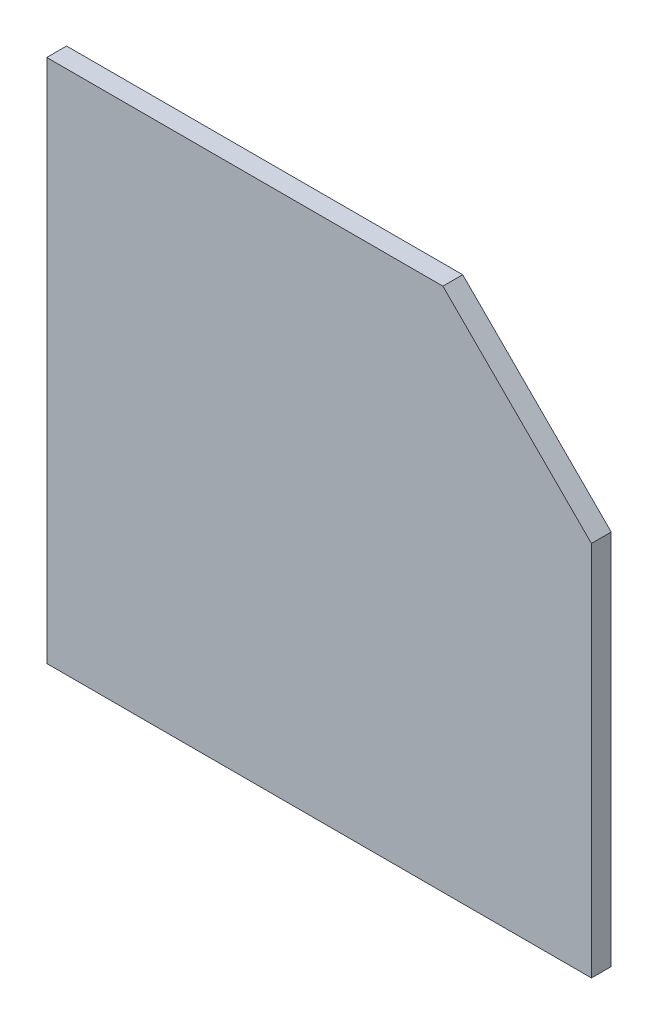
ISO-10303-21;
HEADER;
FILE_DESCRIPTION(('STEP AP214'),'2;1');
FILE_NAME('part.step','',(''),(''),'','','');
FILE_SCHEMA(('AUTOMOTIVE_DESIGN { 1 0 10303 214 1 1 1 1 }'));
ENDSEC;
DATA;
#1=APPLICATION_CONTEXT('core data for automotive mechanical design processes');
#2=APPLICATION_PROTOCOL_DEFINITION('international standard','automotive_design',2000,#1);
#3=PRODUCT_CONTEXT('',#1,'mechanical');
#4=PRODUCT('Part','Part','',(#3));
#5=PRODUCT_RELATED_PRODUCT_CATEGORY('part','',(#4));
#6=PRODUCT_DEFINITION_FORMATION('','',#4);
#7=PRODUCT_DEFINITION_CONTEXT('part definition',#1,'design');
#8=PRODUCT_DEFINITION('design','',#6,#7);
#9=PRODUCT_DEFINITION_SHAPE('','',#8);
#10=(LENGTH_UNIT() NAMED_UNIT(*) SI_UNIT(.MILLI.,.METRE.));
#11=(NAMED_UNIT(*) PLANE_ANGLE_UNIT() SI_UNIT($,.RADIAN.));
#12=(NAMED_UNIT(*) SI_UNIT($,.STERADIAN.) SOLID_ANGLE_UNIT());
#13=UNCERTAINTY_MEASURE_WITH_UNIT(LENGTH_MEASURE(1.E-05),#10,'distance_accuracy_value','');
#14=(GEOMETRIC_REPRESENTATION_CONTEXT(3) GLOBAL_UNCERTAINTY_ASSIGNED_CONTEXT((#13)) GLOBAL_UNIT_ASSIGNED_CONTEXT((#10,
#11,#12)) REPRESENTATION_CONTEXT('',''));
#15=CARTESIAN_POINT('',(0.,0.,0.));
#16=DIRECTION('',(0.,0.,1.));
#17=DIRECTION('',(1.,0.,0.));
#18=AXIS2_PLACEMENT_3D('',#15,#16,#17);
#19=CARTESIAN_POINT('',(0.,0.,40.));
#20=DIRECTION('',(-1.,0.,0.));
#21=DIRECTION('',(0.,0.,1.));
#22=AXIS2_PLACEMENT_3D('',#19,#20,#21);
#23=PLANE('',#22);
#24=DIRECTION('',(0.,0.,-1.));
#25=VECTOR('',#24,1.);
#26=CARTESIAN_POINT('',(0.,760.,2000.17014948931));
#27=LINE('',#26,#25);
#28=CARTESIAN_POINT('',(0.,760.,40.));
#29=VERTEX_POINT('',#28);
#30=CARTESIAN_POINT('',(0.,760.,0.));
#31=VERTEX_POINT('',#30);
#32=EDGE_CURVE('E52',#29,#31,#27,.T.);
#33=ORIENTED_EDGE('',*,*,#32,.F.);
#34=DIRECTION('',(0.,1.,0.));
#35=VECTOR('',#34,1.);
#36=CARTESIAN_POINT('',(0.,0.,40.));
#37=LINE('',#36,#35);
#38=CARTESIAN_POINT('',(0.,0.,40.));
#39=VERTEX_POINT('',#38);
#40=EDGE_CURVE('E121',#39,#29,#37,.T.);
#41=ORIENTED_EDGE('',*,*,#40,.F.);
#42=DIRECTION('',(0.,0.,-1.));
#43=VECTOR('',#42,1.);
#44=CARTESIAN_POINT('',(0.,0.,40.));
#45=LINE('',#44,#43);
#46=CARTESIAN_POINT('',(0.,0.,0.));
#47=VERTEX_POINT('',#46);
#48=EDGE_CURVE('E122',#39,#47,#45,.T.);
#49=ORIENTED_EDGE('',*,*,#48,.T.);
#50=DIRECTION('',(0.,1.,0.));
#51=VECTOR('',#50,1.);
#52=CARTESIAN_POINT('',(0.,0.,0.));
#53=LINE('',#52,#51);
#54=EDGE_CURVE('E111',#47,#31,#53,.T.);
#55=ORIENTED_EDGE('',*,*,#54,.T.);
#56=EDGE_LOOP('',(#33,#41,#49,#55));
#57=FACE_BOUND('',#56,.T.);
#58=ADVANCED_FACE('F37',(#57),#23,.F.);
#59=CARTESIAN_POINT('',(0.,1060.,40.));
#60=DIRECTION('',(0.,-1.,0.));
#61=DIRECTION('',(1.,0.,0.));
#62=AXIS2_PLACEMENT_3D('',#59,#60,#61);
#63=PLANE('',#62);
#64=DIRECTION('',(0.,0.,-1.));
#65=VECTOR('',#64,1.);
#66=CARTESIAN_POINT('',(-300.,1060.,2000.17014948931));
#67=LINE('',#66,#65);
#68=CARTESIAN_POINT('',(-300.,1060.,40.));
#69=VERTEX_POINT('',#68);
#70=CARTESIAN_POINT('',(-300.,1060.,0.));
#71=VERTEX_POINT('',#70);
#72=EDGE_CURVE('E94',#69,#71,#67,.T.);
#73=ORIENTED_EDGE('',*,*,#72,.T.);
#74=DIRECTION('',(-1.,0.,0.));
#75=VECTOR('',#74,1.);
#76=CARTESIAN_POINT('',(0.,1060.,0.));
#77=LINE('',#76,#75);
#78=CARTESIAN_POINT('',(-1100.,1060.,0.));
#79=VERTEX_POINT('',#78);
#80=EDGE_CURVE('E103',#71,#79,#77,.T.);
#81=ORIENTED_EDGE('',*,*,#80,.T.);
#82=DIRECTION('',(0.,0.,-1.));
#83=VECTOR('',#82,1.);
#84=CARTESIAN_POINT('',(-1100.,1060.,40.));
#85=LINE('',#84,#83);
#86=CARTESIAN_POINT('',(-1100.,1060.,40.));
#87=VERTEX_POINT('',#86);
#88=EDGE_CURVE('E11',#87,#79,#85,.T.);
#89=ORIENTED_EDGE('',*,*,#88,.F.);
#90=DIRECTION('',(-1.,0.,0.));
#91=VECTOR('',#90,1.);
#92=CARTESIAN_POINT('',(0.,1060.,40.));
#93=LINE('',#92,#91);
#94=EDGE_CURVE('E83',#69,#87,#93,.T.);
#95=ORIENTED_EDGE('',*,*,#94,.F.);
#96=EDGE_LOOP('',(#73,#81,#89,#95));
#97=FACE_BOUND('',#96,.T.);
#98=ADVANCED_FACE('F102',(#97),#63,.F.);
#99=CARTESIAN_POINT('',(0.,0.,40.));
#100=DIRECTION('',(0.,0.,1.));
#101=DIRECTION('',(1.,0.,0.));
#102=AXIS2_PLACEMENT_3D('',#99,#100,#101);
#103=PLANE('',#102);
#104=ORIENTED_EDGE('',*,*,#40,.T.);
#105=DIRECTION('',(0.707106781186547,-0.707106781186548,0.));
#106=VECTOR('',#105,1.);
#107=CARTESIAN_POINT('',(-300.,1060.,40.));
#108=LINE('',#107,#106);
#109=EDGE_CURVE('E105',#69,#29,#108,.T.);
#110=ORIENTED_EDGE('',*,*,#109,.F.);
#111=ORIENTED_EDGE('',*,*,#94,.T.);
#112=DIRECTION('',(0.,-1.,0.));
#113=VECTOR('',#112,1.);
#114=CARTESIAN_POINT('',(-1100.,0.,40.));
#115=LINE('',#114,#113);
#116=CARTESIAN_POINT('',(-1100.,0.,40.));
#117=VERTEX_POINT('',#116);
#118=EDGE_CURVE('E134',#87,#117,#115,.T.);
#119=ORIENTED_EDGE('',*,*,#118,.T.);
#120=DIRECTION('',(1.,0.,0.));
#121=VECTOR('',#120,1.);
#122=CARTESIAN_POINT('',(0.,0.,40.));
#123=LINE('',#122,#121);
#124=EDGE_CURVE('E61',#117,#39,#123,.T.);
#125=ORIENTED_EDGE('',*,*,#124,.T.);
#126=EDGE_LOOP('',(#104,#110,#111,#119,#125));
#127=FACE_BOUND('',#126,.T.);
#128=ADVANCED_FACE('F140',(#127),#103,.T.);
#129=CARTESIAN_POINT('',(-1100.,0.,40.));
#130=DIRECTION('',(1.,0.,0.));
#131=DIRECTION('',(0.,0.,-1.));
#132=AXIS2_PLACEMENT_3D('',#129,#130,#131);
#133=PLANE('',#132);
#134=DIRECTION('',(0.,-1.,0.));
#135=VECTOR('',#134,1.);
#136=CARTESIAN_POINT('',(-1100.,0.,0.));
#137=LINE('',#136,#135);
#138=CARTESIAN_POINT('',(-1100.,0.,0.));
#139=VERTEX_POINT('',#138);
#140=EDGE_CURVE('E109',#79,#139,#137,.T.);
#141=ORIENTED_EDGE('',*,*,#140,.T.);
#142=DIRECTION('',(0.,0.,-1.));
#143=VECTOR('',#142,1.);
#144=CARTESIAN_POINT('',(-1100.,0.,40.));
#145=LINE('',#144,#143);
#146=EDGE_CURVE('E45',#117,#139,#145,.T.);
#147=ORIENTED_EDGE('',*,*,#146,.F.);
#148=ORIENTED_EDGE('',*,*,#118,.F.);
#149=ORIENTED_EDGE('',*,*,#88,.T.);
#150=EDGE_LOOP('',(#141,#147,#148,#149));
#151=FACE_BOUND('',#150,.T.);
#152=ADVANCED_FACE('F141',(#151),#133,.F.);
#153=CARTESIAN_POINT('',(0.,0.,40.));
#154=DIRECTION('',(0.,1.,0.));
#155=DIRECTION('',(0.,0.,1.));
#156=AXIS2_PLACEMENT_3D('',#153,#154,#155);
#157=PLANE('',#156);
#158=DIRECTION('',(1.,0.,0.));
#159=VECTOR('',#158,1.);
#160=CARTESIAN_POINT('',(0.,0.,0.));
#161=LINE('',#160,#159);
#162=EDGE_CURVE('E78',#139,#47,#161,.T.);
#163=ORIENTED_EDGE('',*,*,#162,.T.);
#164=ORIENTED_EDGE('',*,*,#48,.F.);
#165=ORIENTED_EDGE('',*,*,#124,.F.);
#166=ORIENTED_EDGE('',*,*,#146,.T.);
#167=EDGE_LOOP('',(#163,#164,#165,#166));
#168=FACE_BOUND('',#167,.T.);
#169=ADVANCED_FACE('F126',(#168),#157,.F.);
#170=CARTESIAN_POINT('',(0.,0.,0.));
#171=DIRECTION('',(0.,0.,1.));
#172=DIRECTION('',(1.,0.,0.));
#173=AXIS2_PLACEMENT_3D('',#170,#171,#172);
#174=PLANE('',#173);
#175=ORIENTED_EDGE('',*,*,#80,.F.);
#176=DIRECTION('',(0.707106781186547,-0.707106781186548,0.));
#177=VECTOR('',#176,1.);
#178=CARTESIAN_POINT('',(-300.,1060.,0.));
#179=LINE('',#178,#177);
#180=EDGE_CURVE('E91',#71,#31,#179,.T.);
#181=ORIENTED_EDGE('',*,*,#180,.T.);
#182=ORIENTED_EDGE('',*,*,#54,.F.);
#183=ORIENTED_EDGE('',*,*,#162,.F.);
#184=ORIENTED_EDGE('',*,*,#140,.F.);
#185=EDGE_LOOP('',(#175,#181,#182,#183,#184));
#186=FACE_BOUND('',#185,.T.);
#187=ADVANCED_FACE('F108',(#186),#174,.F.);
#188=CARTESIAN_POINT('',(-300.,1060.,2000.17014948931));
#189=DIRECTION('',(0.707106781186548,0.707106781186547,0.));
#190=DIRECTION('',(-0.707106781186547,0.707106781186548,0.));
#191=AXIS2_PLACEMENT_3D('',#188,#189,#190);
#192=PLANE('',#191);
#193=ORIENTED_EDGE('',*,*,#72,.F.);
#194=ORIENTED_EDGE('',*,*,#109,.T.);
#195=ORIENTED_EDGE('',*,*,#32,.T.);
#196=ORIENTED_EDGE('',*,*,#180,.F.);
#197=EDGE_LOOP('',(#193,#194,#195,#196));
#198=FACE_BOUND('',#197,.T.);
#199=ADVANCED_FACE('F93',(#198),#192,.T.);
#200=CLOSED_SHELL('',(#58,#98,#128,#152,#169,#187,#199));
#201=MANIFOLD_SOLID_BREP('B2',#200);
#202=ADVANCED_BREP_SHAPE_REPRESENTATION('',(#18,#201),#14);
#203=SHAPE_DEFINITION_REPRESENTATION(#9,#202);
ENDSEC;
END-ISO-10303-21;
